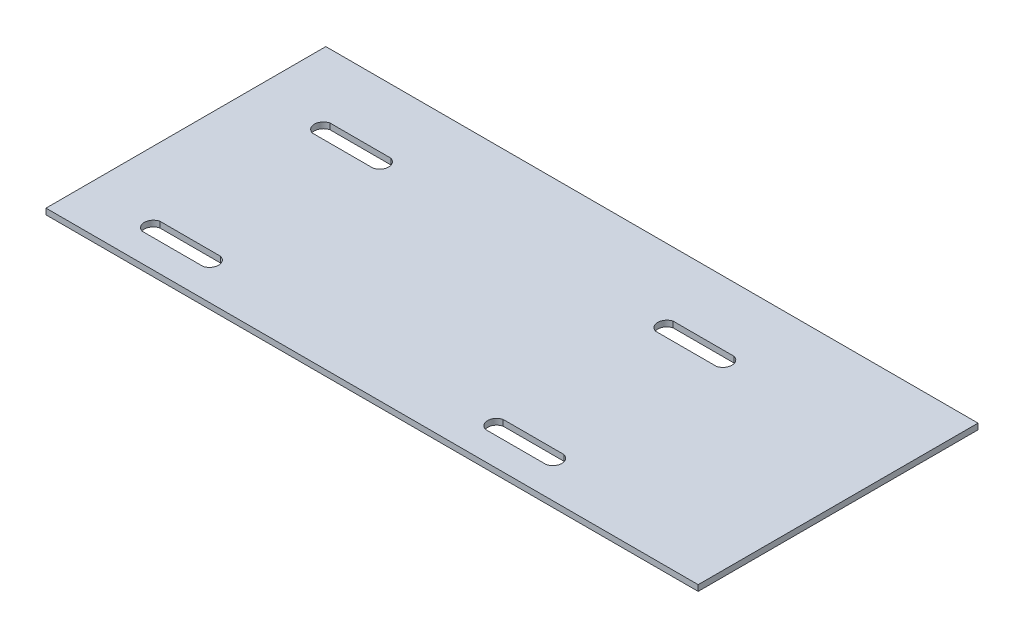
ISO-10303-21;
HEADER;
FILE_DESCRIPTION(('STEP AP214'),'2;1');
FILE_NAME('part.step','',(''),(''),'','','');
FILE_SCHEMA(('AUTOMOTIVE_DESIGN { 1 0 10303 214 1 1 1 1 }'));
ENDSEC;
DATA;
#1=APPLICATION_CONTEXT('core data for automotive mechanical design processes');
#2=APPLICATION_PROTOCOL_DEFINITION('international standard','automotive_design',2000,#1);
#3=PRODUCT_CONTEXT('',#1,'mechanical');
#4=PRODUCT('Part','Part','',(#3));
#5=PRODUCT_RELATED_PRODUCT_CATEGORY('part','',(#4));
#6=PRODUCT_DEFINITION_FORMATION('','',#4);
#7=PRODUCT_DEFINITION_CONTEXT('part definition',#1,'design');
#8=PRODUCT_DEFINITION('design','',#6,#7);
#9=PRODUCT_DEFINITION_SHAPE('','',#8);
#10=(LENGTH_UNIT() NAMED_UNIT(*) SI_UNIT(.MILLI.,.METRE.));
#11=(NAMED_UNIT(*) PLANE_ANGLE_UNIT() SI_UNIT($,.RADIAN.));
#12=(NAMED_UNIT(*) SI_UNIT($,.STERADIAN.) SOLID_ANGLE_UNIT());
#13=UNCERTAINTY_MEASURE_WITH_UNIT(LENGTH_MEASURE(1.E-05),#10,'distance_accuracy_value','');
#14=(GEOMETRIC_REPRESENTATION_CONTEXT(3) GLOBAL_UNCERTAINTY_ASSIGNED_CONTEXT((#13)) GLOBAL_UNIT_ASSIGNED_CONTEXT((#10,
#11,#12)) REPRESENTATION_CONTEXT('',''));
#15=CARTESIAN_POINT('',(0.,0.,0.));
#16=DIRECTION('',(0.,0.,1.));
#17=DIRECTION('',(1.,0.,0.));
#18=AXIS2_PLACEMENT_3D('',#15,#16,#17);
#19=CARTESIAN_POINT('',(0.,2.73,0.));
#20=DIRECTION('',(0.,1.,0.));
#21=DIRECTION('',(0.,0.,1.));
#22=AXIS2_PLACEMENT_3D('',#19,#20,#21);
#23=PLANE('',#22);
#24=DIRECTION('',(1.,0.,0.));
#25=VECTOR('',#24,1.);
#26=CARTESIAN_POINT('',(191.162705571737,2.73,-47.0872012496927));
#27=LINE('',#26,#25);
#28=CARTESIAN_POINT('',(191.162705571737,2.73,-47.0872012496927));
#29=VERTEX_POINT('',#28);
#30=CARTESIAN_POINT('',(219.456939220192,2.73,-47.0872012496927));
#31=VERTEX_POINT('',#30);
#32=EDGE_CURVE('E207',#29,#31,#27,.T.);
#33=ORIENTED_EDGE('',*,*,#32,.F.);
#34=CARTESIAN_POINT('',(192.280296995363,2.73,-51.1622012496927));
#35=DIRECTION('',(0.,1.,0.));
#36=DIRECTION('',(0.,0.,1.));
#37=AXIS2_PLACEMENT_3D('',#34,#35,#36);
#38=CIRCLE('',#37,4.2254745993986);
#39=CARTESIAN_POINT('',(191.162705571737,2.73,-55.2372012496927));
#40=VERTEX_POINT('',#39);
#41=EDGE_CURVE('E205',#40,#29,#38,.T.);
#42=ORIENTED_EDGE('',*,*,#41,.F.);
#43=DIRECTION('',(-1.,0.,0.));
#44=VECTOR('',#43,1.);
#45=CARTESIAN_POINT('',(191.162705571737,2.73,-55.2372012496927));
#46=LINE('',#45,#44);
#47=CARTESIAN_POINT('',(219.456939220192,2.73,-55.2372012496927));
#48=VERTEX_POINT('',#47);
#49=EDGE_CURVE('E213',#48,#40,#46,.T.);
#50=ORIENTED_EDGE('',*,*,#49,.F.);
#51=CARTESIAN_POINT('',(218.339347796566,2.73,-51.1622012496927));
#52=DIRECTION('',(0.,1.,0.));
#53=DIRECTION('',(0.,0.,-1.));
#54=AXIS2_PLACEMENT_3D('',#51,#52,#53);
#55=CIRCLE('',#54,4.2254745993986);
#56=EDGE_CURVE('E210',#31,#48,#55,.T.);
#57=ORIENTED_EDGE('',*,*,#56,.F.);
#58=EDGE_LOOP('',(#33,#42,#50,#57));
#59=FACE_BOUND('',#58,.T.);
#60=DIRECTION('',(1.,0.,0.));
#61=VECTOR('',#60,1.);
#62=CARTESIAN_POINT('',(31.6678831757724,2.73,-47.0872012496927));
#63=LINE('',#62,#61);
#64=CARTESIAN_POINT('',(31.6678831757724,2.73,-47.0872012496927));
#65=VERTEX_POINT('',#64);
#66=CARTESIAN_POINT('',(59.9621168242275,2.73,-47.0872012496927));
#67=VERTEX_POINT('',#66);
#68=EDGE_CURVE('E269',#65,#67,#63,.T.);
#69=ORIENTED_EDGE('',*,*,#68,.F.);
#70=CARTESIAN_POINT('',(32.7854745993986,2.73,-51.1622012496927));
#71=DIRECTION('',(0.,1.,0.));
#72=DIRECTION('',(0.,0.,1.));
#73=AXIS2_PLACEMENT_3D('',#70,#71,#72);
#74=CIRCLE('',#73,4.2254745993986);
#75=CARTESIAN_POINT('',(31.6678831757724,2.73,-55.2372012496927));
#76=VERTEX_POINT('',#75);
#77=EDGE_CURVE('E267',#76,#65,#74,.T.);
#78=ORIENTED_EDGE('',*,*,#77,.F.);
#79=DIRECTION('',(-1.,0.,0.));
#80=VECTOR('',#79,1.);
#81=CARTESIAN_POINT('',(31.6678831757724,2.73,-55.2372012496927));
#82=LINE('',#81,#80);
#83=CARTESIAN_POINT('',(59.9621168242275,2.73,-55.2372012496927));
#84=VERTEX_POINT('',#83);
#85=EDGE_CURVE('E275',#84,#76,#82,.T.);
#86=ORIENTED_EDGE('',*,*,#85,.F.);
#87=CARTESIAN_POINT('',(58.8445254006014,2.73,-51.1622012496927));
#88=DIRECTION('',(0.,1.,0.));
#89=DIRECTION('',(0.,0.,-1.));
#90=AXIS2_PLACEMENT_3D('',#87,#88,#89);
#91=CIRCLE('',#90,4.2254745993986);
#92=EDGE_CURVE('E272',#67,#84,#91,.T.);
#93=ORIENTED_EDGE('',*,*,#92,.F.);
#94=EDGE_LOOP('',(#69,#78,#86,#93));
#95=FACE_BOUND('',#94,.T.);
#96=DIRECTION('',(0.,0.,1.));
#97=VECTOR('',#96,1.);
#98=CARTESIAN_POINT('',(0.,2.73,-85.0185893853712));
#99=LINE('',#98,#97);
#100=CARTESIAN_POINT('',(0.,2.73,-85.0185893853712));
#101=VERTEX_POINT('',#100);
#102=CARTESIAN_POINT('',(0.,2.73,44.9814106146288));
#103=VERTEX_POINT('',#102);
#104=EDGE_CURVE('E298',#101,#103,#99,.T.);
#105=ORIENTED_EDGE('',*,*,#104,.T.);
#106=DIRECTION('',(1.,0.,0.));
#107=VECTOR('',#106,1.);
#108=CARTESIAN_POINT('',(0.,2.73,44.9814106146288));
#109=LINE('',#108,#107);
#110=CARTESIAN_POINT('',(303.,2.73,44.9814106146288));
#111=VERTEX_POINT('',#110);
#112=EDGE_CURVE('E301',#103,#111,#109,.T.);
#113=ORIENTED_EDGE('',*,*,#112,.T.);
#114=DIRECTION('',(0.,0.,-1.));
#115=VECTOR('',#114,1.);
#116=CARTESIAN_POINT('',(303.,2.73,-85.0185893853712));
#117=LINE('',#116,#115);
#118=CARTESIAN_POINT('',(303.,2.73,-85.0185893853712));
#119=VERTEX_POINT('',#118);
#120=EDGE_CURVE('E304',#111,#119,#117,.T.);
#121=ORIENTED_EDGE('',*,*,#120,.T.);
#122=DIRECTION('',(-1.,0.,0.));
#123=VECTOR('',#122,1.);
#124=CARTESIAN_POINT('',(0.,2.73,-85.0185893853712));
#125=LINE('',#124,#123);
#126=EDGE_CURVE('E306',#119,#101,#125,.T.);
#127=ORIENTED_EDGE('',*,*,#126,.T.);
#128=EDGE_LOOP('',(#105,#113,#121,#127));
#129=FACE_BOUND('',#128,.T.);
#130=DIRECTION('',(1.,0.,0.));
#131=VECTOR('',#130,1.);
#132=CARTESIAN_POINT('',(31.6678831757724,2.73,31.9514106146288));
#133=LINE('',#132,#131);
#134=CARTESIAN_POINT('',(31.6678831757724,2.73,31.9514106146288));
#135=VERTEX_POINT('',#134);
#136=CARTESIAN_POINT('',(59.9621168242275,2.73,31.9514106146288));
#137=VERTEX_POINT('',#136);
#138=EDGE_CURVE('E238',#135,#137,#133,.T.);
#139=ORIENTED_EDGE('',*,*,#138,.F.);
#140=CARTESIAN_POINT('',(32.7854745993986,2.73,27.8764106146288));
#141=DIRECTION('',(0.,1.,0.));
#142=DIRECTION('',(0.,0.,1.));
#143=AXIS2_PLACEMENT_3D('',#140,#141,#142);
#144=CIRCLE('',#143,4.2254745993986);
#145=CARTESIAN_POINT('',(31.6678831757724,2.73,23.8014106146288));
#146=VERTEX_POINT('',#145);
#147=EDGE_CURVE('E236',#146,#135,#144,.T.);
#148=ORIENTED_EDGE('',*,*,#147,.F.);
#149=DIRECTION('',(-1.,0.,0.));
#150=VECTOR('',#149,1.);
#151=CARTESIAN_POINT('',(31.6678831757724,2.73,23.8014106146288));
#152=LINE('',#151,#150);
#153=CARTESIAN_POINT('',(59.9621168242275,2.73,23.8014106146288));
#154=VERTEX_POINT('',#153);
#155=EDGE_CURVE('E244',#154,#146,#152,.T.);
#156=ORIENTED_EDGE('',*,*,#155,.F.);
#157=CARTESIAN_POINT('',(58.8445254006014,2.73,27.8764106146288));
#158=DIRECTION('',(0.,1.,0.));
#159=DIRECTION('',(0.,0.,-1.));
#160=AXIS2_PLACEMENT_3D('',#157,#158,#159);
#161=CIRCLE('',#160,4.2254745993986);
#162=EDGE_CURVE('E241',#137,#154,#161,.T.);
#163=ORIENTED_EDGE('',*,*,#162,.F.);
#164=EDGE_LOOP('',(#139,#148,#156,#163));
#165=FACE_BOUND('',#164,.T.);
#166=DIRECTION('',(1.,0.,0.));
#167=VECTOR('',#166,1.);
#168=CARTESIAN_POINT('',(191.162705571737,2.73,31.9514106146288));
#169=LINE('',#168,#167);
#170=CARTESIAN_POINT('',(191.162705571737,2.73,31.9514106146288));
#171=VERTEX_POINT('',#170);
#172=CARTESIAN_POINT('',(219.456939220192,2.73,31.9514106146288));
#173=VERTEX_POINT('',#172);
#174=EDGE_CURVE('E177',#171,#173,#169,.T.);
#175=ORIENTED_EDGE('',*,*,#174,.F.);
#176=CARTESIAN_POINT('',(192.280296995363,2.73,27.8764106146288));
#177=DIRECTION('',(0.,1.,0.));
#178=DIRECTION('',(0.,0.,1.));
#179=AXIS2_PLACEMENT_3D('',#176,#177,#178);
#180=CIRCLE('',#179,4.2254745993986);
#181=CARTESIAN_POINT('',(191.162705571737,2.73,23.8014106146288));
#182=VERTEX_POINT('',#181);
#183=EDGE_CURVE('E169',#182,#171,#180,.T.);
#184=ORIENTED_EDGE('',*,*,#183,.F.);
#185=DIRECTION('',(-1.,0.,0.));
#186=VECTOR('',#185,1.);
#187=CARTESIAN_POINT('',(191.162705571737,2.73,23.8014106146288));
#188=LINE('',#187,#186);
#189=CARTESIAN_POINT('',(219.456939220192,2.73,23.8014106146288));
#190=VERTEX_POINT('',#189);
#191=EDGE_CURVE('E191',#190,#182,#188,.T.);
#192=ORIENTED_EDGE('',*,*,#191,.F.);
#193=CARTESIAN_POINT('',(218.339347796566,2.73,27.8764106146288));
#194=DIRECTION('',(0.,1.,0.));
#195=DIRECTION('',(0.,0.,-1.));
#196=AXIS2_PLACEMENT_3D('',#193,#194,#195);
#197=CIRCLE('',#196,4.2254745993986);
#198=EDGE_CURVE('E189',#173,#190,#197,.T.);
#199=ORIENTED_EDGE('',*,*,#198,.F.);
#200=EDGE_LOOP('',(#175,#184,#192,#199));
#201=FACE_BOUND('',#200,.T.);
#202=ADVANCED_FACE('F32',(#59,#95,#129,#165,#201),#23,.T.);
#203=CARTESIAN_POINT('',(0.,0.,0.));
#204=DIRECTION('',(0.,1.,0.));
#205=DIRECTION('',(0.,0.,1.));
#206=AXIS2_PLACEMENT_3D('',#203,#204,#205);
#207=PLANE('',#206);
#208=CARTESIAN_POINT('',(192.280296995363,0.,-51.1622012496927));
#209=DIRECTION('',(0.,1.,0.));
#210=DIRECTION('',(0.,0.,1.));
#211=AXIS2_PLACEMENT_3D('',#208,#209,#210);
#212=CIRCLE('',#211,4.2254745993986);
#213=CARTESIAN_POINT('',(191.162705571737,0.,-55.2372012496927));
#214=VERTEX_POINT('',#213);
#215=CARTESIAN_POINT('',(191.162705571737,0.,-47.0872012496927));
#216=VERTEX_POINT('',#215);
#217=EDGE_CURVE('E185',#214,#216,#212,.T.);
#218=ORIENTED_EDGE('',*,*,#217,.T.);
#219=DIRECTION('',(1.,0.,0.));
#220=VECTOR('',#219,1.);
#221=CARTESIAN_POINT('',(191.162705571737,0.,-47.0872012496927));
#222=LINE('',#221,#220);
#223=CARTESIAN_POINT('',(219.456939220192,0.,-47.0872012496927));
#224=VERTEX_POINT('',#223);
#225=EDGE_CURVE('E218',#216,#224,#222,.T.);
#226=ORIENTED_EDGE('',*,*,#225,.T.);
#227=CARTESIAN_POINT('',(218.339347796566,0.,-51.1622012496927));
#228=DIRECTION('',(0.,1.,0.));
#229=DIRECTION('',(0.,0.,-1.));
#230=AXIS2_PLACEMENT_3D('',#227,#228,#229);
#231=CIRCLE('',#230,4.2254745993986);
#232=CARTESIAN_POINT('',(219.456939220192,0.,-55.2372012496927));
#233=VERTEX_POINT('',#232);
#234=EDGE_CURVE('E221',#224,#233,#231,.T.);
#235=ORIENTED_EDGE('',*,*,#234,.T.);
#236=DIRECTION('',(-1.,0.,0.));
#237=VECTOR('',#236,1.);
#238=CARTESIAN_POINT('',(191.162705571737,0.,-55.2372012496927));
#239=LINE('',#238,#237);
#240=EDGE_CURVE('E208',#233,#214,#239,.T.);
#241=ORIENTED_EDGE('',*,*,#240,.T.);
#242=EDGE_LOOP('',(#218,#226,#235,#241));
#243=FACE_BOUND('',#242,.T.);
#244=CARTESIAN_POINT('',(32.7854745993986,0.,-51.1622012496927));
#245=DIRECTION('',(0.,1.,0.));
#246=DIRECTION('',(0.,0.,1.));
#247=AXIS2_PLACEMENT_3D('',#244,#245,#246);
#248=CIRCLE('',#247,4.2254745993986);
#249=CARTESIAN_POINT('',(31.6678831757724,0.,-55.2372012496927));
#250=VERTEX_POINT('',#249);
#251=CARTESIAN_POINT('',(31.6678831757724,0.,-47.0872012496927));
#252=VERTEX_POINT('',#251);
#253=EDGE_CURVE('E266',#250,#252,#248,.T.);
#254=ORIENTED_EDGE('',*,*,#253,.T.);
#255=DIRECTION('',(1.,0.,0.));
#256=VECTOR('',#255,1.);
#257=CARTESIAN_POINT('',(31.6678831757724,0.,-47.0872012496927));
#258=LINE('',#257,#256);
#259=CARTESIAN_POINT('',(59.9621168242275,0.,-47.0872012496927));
#260=VERTEX_POINT('',#259);
#261=EDGE_CURVE('E280',#252,#260,#258,.T.);
#262=ORIENTED_EDGE('',*,*,#261,.T.);
#263=CARTESIAN_POINT('',(58.8445254006014,0.,-51.1622012496927));
#264=DIRECTION('',(0.,1.,0.));
#265=DIRECTION('',(0.,0.,-1.));
#266=AXIS2_PLACEMENT_3D('',#263,#264,#265);
#267=CIRCLE('',#266,4.2254745993986);
#268=CARTESIAN_POINT('',(59.9621168242275,0.,-55.2372012496927));
#269=VERTEX_POINT('',#268);
#270=EDGE_CURVE('E283',#260,#269,#267,.T.);
#271=ORIENTED_EDGE('',*,*,#270,.T.);
#272=DIRECTION('',(-1.,0.,0.));
#273=VECTOR('',#272,1.);
#274=CARTESIAN_POINT('',(31.6678831757724,0.,-55.2372012496927));
#275=LINE('',#274,#273);
#276=EDGE_CURVE('E270',#269,#250,#275,.T.);
#277=ORIENTED_EDGE('',*,*,#276,.T.);
#278=EDGE_LOOP('',(#254,#262,#271,#277));
#279=FACE_BOUND('',#278,.T.);
#280=DIRECTION('',(0.,0.,1.));
#281=VECTOR('',#280,1.);
#282=CARTESIAN_POINT('',(0.,0.,-85.0185893853712));
#283=LINE('',#282,#281);
#284=CARTESIAN_POINT('',(0.,0.,-85.0185893853712));
#285=VERTEX_POINT('',#284);
#286=CARTESIAN_POINT('',(0.,0.,44.9814106146288));
#287=VERTEX_POINT('',#286);
#288=EDGE_CURVE('E297',#285,#287,#283,.T.);
#289=ORIENTED_EDGE('',*,*,#288,.F.);
#290=DIRECTION('',(-1.,0.,0.));
#291=VECTOR('',#290,1.);
#292=CARTESIAN_POINT('',(0.,0.,-85.0185893853712));
#293=LINE('',#292,#291);
#294=CARTESIAN_POINT('',(303.,0.,-85.0185893853712));
#295=VERTEX_POINT('',#294);
#296=EDGE_CURVE('E302',#295,#285,#293,.T.);
#297=ORIENTED_EDGE('',*,*,#296,.F.);
#298=DIRECTION('',(0.,0.,-1.));
#299=VECTOR('',#298,1.);
#300=CARTESIAN_POINT('',(303.,0.,-85.0185893853712));
#301=LINE('',#300,#299);
#302=CARTESIAN_POINT('',(303.,0.,44.9814106146288));
#303=VERTEX_POINT('',#302);
#304=EDGE_CURVE('E313',#303,#295,#301,.T.);
#305=ORIENTED_EDGE('',*,*,#304,.F.);
#306=DIRECTION('',(1.,0.,0.));
#307=VECTOR('',#306,1.);
#308=CARTESIAN_POINT('',(0.,0.,44.9814106146288));
#309=LINE('',#308,#307);
#310=EDGE_CURVE('E311',#287,#303,#309,.T.);
#311=ORIENTED_EDGE('',*,*,#310,.F.);
#312=EDGE_LOOP('',(#289,#297,#305,#311));
#313=FACE_BOUND('',#312,.T.);
#314=CARTESIAN_POINT('',(32.7854745993986,0.,27.8764106146288));
#315=DIRECTION('',(0.,1.,0.));
#316=DIRECTION('',(0.,0.,1.));
#317=AXIS2_PLACEMENT_3D('',#314,#315,#316);
#318=CIRCLE('',#317,4.2254745993986);
#319=CARTESIAN_POINT('',(31.6678831757724,0.,23.8014106146288));
#320=VERTEX_POINT('',#319);
#321=CARTESIAN_POINT('',(31.6678831757724,0.,31.9514106146288));
#322=VERTEX_POINT('',#321);
#323=EDGE_CURVE('E235',#320,#322,#318,.T.);
#324=ORIENTED_EDGE('',*,*,#323,.T.);
#325=DIRECTION('',(1.,0.,0.));
#326=VECTOR('',#325,1.);
#327=CARTESIAN_POINT('',(31.6678831757724,0.,31.9514106146288));
#328=LINE('',#327,#326);
#329=CARTESIAN_POINT('',(59.9621168242275,0.,31.9514106146288));
#330=VERTEX_POINT('',#329);
#331=EDGE_CURVE('E249',#322,#330,#328,.T.);
#332=ORIENTED_EDGE('',*,*,#331,.T.);
#333=CARTESIAN_POINT('',(58.8445254006014,0.,27.8764106146288));
#334=DIRECTION('',(0.,1.,0.));
#335=DIRECTION('',(0.,0.,-1.));
#336=AXIS2_PLACEMENT_3D('',#333,#334,#335);
#337=CIRCLE('',#336,4.2254745993986);
#338=CARTESIAN_POINT('',(59.9621168242275,0.,23.8014106146288));
#339=VERTEX_POINT('',#338);
#340=EDGE_CURVE('E252',#330,#339,#337,.T.);
#341=ORIENTED_EDGE('',*,*,#340,.T.);
#342=DIRECTION('',(-1.,0.,0.));
#343=VECTOR('',#342,1.);
#344=CARTESIAN_POINT('',(31.6678831757724,0.,23.8014106146288));
#345=LINE('',#344,#343);
#346=EDGE_CURVE('E239',#339,#320,#345,.T.);
#347=ORIENTED_EDGE('',*,*,#346,.T.);
#348=EDGE_LOOP('',(#324,#332,#341,#347));
#349=FACE_BOUND('',#348,.T.);
#350=CARTESIAN_POINT('',(192.280296995363,0.,27.8764106146288));
#351=DIRECTION('',(0.,1.,0.));
#352=DIRECTION('',(0.,0.,1.));
#353=AXIS2_PLACEMENT_3D('',#350,#351,#352);
#354=CIRCLE('',#353,4.2254745993986);
#355=CARTESIAN_POINT('',(191.162705571737,0.,23.8014106146288));
#356=VERTEX_POINT('',#355);
#357=CARTESIAN_POINT('',(191.162705571737,0.,31.9514106146288));
#358=VERTEX_POINT('',#357);
#359=EDGE_CURVE('E55',#356,#358,#354,.T.);
#360=ORIENTED_EDGE('',*,*,#359,.T.);
#361=DIRECTION('',(1.,0.,0.));
#362=VECTOR('',#361,1.);
#363=CARTESIAN_POINT('',(191.162705571737,0.,31.9514106146288));
#364=LINE('',#363,#362);
#365=CARTESIAN_POINT('',(219.456939220192,0.,31.9514106146288));
#366=VERTEX_POINT('',#365);
#367=EDGE_CURVE('E184',#358,#366,#364,.T.);
#368=ORIENTED_EDGE('',*,*,#367,.T.);
#369=CARTESIAN_POINT('',(218.339347796566,0.,27.8764106146288));
#370=DIRECTION('',(0.,1.,0.));
#371=DIRECTION('',(0.,0.,-1.));
#372=AXIS2_PLACEMENT_3D('',#369,#370,#371);
#373=CIRCLE('',#372,4.2254745993986);
#374=CARTESIAN_POINT('',(219.456939220192,0.,23.8014106146288));
#375=VERTEX_POINT('',#374);
#376=EDGE_CURVE('E197',#366,#375,#373,.T.);
#377=ORIENTED_EDGE('',*,*,#376,.T.);
#378=DIRECTION('',(-1.,0.,0.));
#379=VECTOR('',#378,1.);
#380=CARTESIAN_POINT('',(191.162705571737,0.,23.8014106146288));
#381=LINE('',#380,#379);
#382=EDGE_CURVE('E178',#375,#356,#381,.T.);
#383=ORIENTED_EDGE('',*,*,#382,.T.);
#384=EDGE_LOOP('',(#360,#368,#377,#383));
#385=FACE_BOUND('',#384,.T.);
#386=ADVANCED_FACE('F331',(#243,#279,#313,#349,#385),#207,.F.);
#387=CARTESIAN_POINT('',(0.,2.73,-85.0185893853712));
#388=DIRECTION('',(1.,0.,0.));
#389=DIRECTION('',(0.,0.,-1.));
#390=AXIS2_PLACEMENT_3D('',#387,#388,#389);
#391=PLANE('',#390);
#392=ORIENTED_EDGE('',*,*,#288,.T.);
#393=DIRECTION('',(0.,-1.,0.));
#394=VECTOR('',#393,1.);
#395=CARTESIAN_POINT('',(0.,2.73,44.9814106146288));
#396=LINE('',#395,#394);
#397=EDGE_CURVE('E11',#103,#287,#396,.T.);
#398=ORIENTED_EDGE('',*,*,#397,.F.);
#399=ORIENTED_EDGE('',*,*,#104,.F.);
#400=DIRECTION('',(0.,-1.,0.));
#401=VECTOR('',#400,1.);
#402=CARTESIAN_POINT('',(0.,2.73,-85.0185893853712));
#403=LINE('',#402,#401);
#404=EDGE_CURVE('E308',#101,#285,#403,.T.);
#405=ORIENTED_EDGE('',*,*,#404,.T.);
#406=EDGE_LOOP('',(#392,#398,#399,#405));
#407=FACE_BOUND('',#406,.T.);
#408=ADVANCED_FACE('F34',(#407),#391,.F.);
#409=CARTESIAN_POINT('',(0.,2.73,44.9814106146288));
#410=DIRECTION('',(0.,0.,-1.));
#411=DIRECTION('',(-1.,0.,0.));
#412=AXIS2_PLACEMENT_3D('',#409,#410,#411);
#413=PLANE('',#412);
#414=ORIENTED_EDGE('',*,*,#310,.T.);
#415=DIRECTION('',(0.,-1.,0.));
#416=VECTOR('',#415,1.);
#417=CARTESIAN_POINT('',(303.,2.73,44.9814106146288));
#418=LINE('',#417,#416);
#419=EDGE_CURVE('E40',#111,#303,#418,.T.);
#420=ORIENTED_EDGE('',*,*,#419,.F.);
#421=ORIENTED_EDGE('',*,*,#112,.F.);
#422=ORIENTED_EDGE('',*,*,#397,.T.);
#423=EDGE_LOOP('',(#414,#420,#421,#422));
#424=FACE_BOUND('',#423,.T.);
#425=ADVANCED_FACE('F342',(#424),#413,.F.);
#426=CARTESIAN_POINT('',(303.,2.73,-85.0185893853712));
#427=DIRECTION('',(-1.,0.,0.));
#428=DIRECTION('',(0.,0.,1.));
#429=AXIS2_PLACEMENT_3D('',#426,#427,#428);
#430=PLANE('',#429);
#431=ORIENTED_EDGE('',*,*,#304,.T.);
#432=DIRECTION('',(0.,-1.,0.));
#433=VECTOR('',#432,1.);
#434=CARTESIAN_POINT('',(303.,2.73,-85.0185893853712));
#435=LINE('',#434,#433);
#436=EDGE_CURVE('E318',#119,#295,#435,.T.);
#437=ORIENTED_EDGE('',*,*,#436,.F.);
#438=ORIENTED_EDGE('',*,*,#120,.F.);
#439=ORIENTED_EDGE('',*,*,#419,.T.);
#440=EDGE_LOOP('',(#431,#437,#438,#439));
#441=FACE_BOUND('',#440,.T.);
#442=ADVANCED_FACE('F325',(#441),#430,.F.);
#443=CARTESIAN_POINT('',(0.,2.73,-85.0185893853712));
#444=DIRECTION('',(0.,0.,1.));
#445=DIRECTION('',(1.,0.,0.));
#446=AXIS2_PLACEMENT_3D('',#443,#444,#445);
#447=PLANE('',#446);
#448=ORIENTED_EDGE('',*,*,#296,.T.);
#449=ORIENTED_EDGE('',*,*,#404,.F.);
#450=ORIENTED_EDGE('',*,*,#126,.F.);
#451=ORIENTED_EDGE('',*,*,#436,.T.);
#452=EDGE_LOOP('',(#448,#449,#450,#451));
#453=FACE_BOUND('',#452,.T.);
#454=ADVANCED_FACE('F335',(#453),#447,.F.);
#455=CARTESIAN_POINT('',(32.7854745993986,2.73,-51.1622012496927));
#456=DIRECTION('',(0.,-1.,0.));
#457=DIRECTION('',(0.,0.,-1.));
#458=AXIS2_PLACEMENT_3D('',#455,#456,#457);
#459=CYLINDRICAL_SURFACE('',#458,4.2254745993986);
#460=ORIENTED_EDGE('',*,*,#253,.F.);
#461=DIRECTION('',(0.,-1.,0.));
#462=VECTOR('',#461,1.);
#463=CARTESIAN_POINT('',(31.6678831757724,2.73,-55.2372012496927));
#464=LINE('',#463,#462);
#465=EDGE_CURVE('E277',#76,#250,#464,.T.);
#466=ORIENTED_EDGE('',*,*,#465,.F.);
#467=ORIENTED_EDGE('',*,*,#77,.T.);
#468=DIRECTION('',(0.,-1.,0.));
#469=VECTOR('',#468,1.);
#470=CARTESIAN_POINT('',(31.6678831757724,2.73,-47.0872012496927));
#471=LINE('',#470,#469);
#472=EDGE_CURVE('E294',#65,#252,#471,.T.);
#473=ORIENTED_EDGE('',*,*,#472,.T.);
#474=EDGE_LOOP('',(#460,#466,#467,#473));
#475=FACE_BOUND('',#474,.T.);
#476=ADVANCED_FACE('F360',(#475),#459,.F.);
#477=CARTESIAN_POINT('',(31.6678831757724,2.73,-47.0872012496927));
#478=DIRECTION('',(0.,0.,-1.));
#479=DIRECTION('',(-1.,0.,0.));
#480=AXIS2_PLACEMENT_3D('',#477,#478,#479);
#481=PLANE('',#480);
#482=ORIENTED_EDGE('',*,*,#261,.F.);
#483=ORIENTED_EDGE('',*,*,#472,.F.);
#484=ORIENTED_EDGE('',*,*,#68,.T.);
#485=DIRECTION('',(0.,-1.,0.));
#486=VECTOR('',#485,1.);
#487=CARTESIAN_POINT('',(59.9621168242275,2.73,-47.0872012496927));
#488=LINE('',#487,#486);
#489=EDGE_CURVE('E292',#67,#260,#488,.T.);
#490=ORIENTED_EDGE('',*,*,#489,.T.);
#491=EDGE_LOOP('',(#482,#483,#484,#490));
#492=FACE_BOUND('',#491,.T.);
#493=ADVANCED_FACE('F367',(#492),#481,.T.);
#494=CARTESIAN_POINT('',(58.8445254006014,2.73,-51.1622012496927));
#495=DIRECTION('',(0.,-1.,0.));
#496=DIRECTION('',(0.,0.,-1.));
#497=AXIS2_PLACEMENT_3D('',#494,#495,#496);
#498=CYLINDRICAL_SURFACE('',#497,4.2254745993986);
#499=ORIENTED_EDGE('',*,*,#270,.F.);
#500=ORIENTED_EDGE('',*,*,#489,.F.);
#501=ORIENTED_EDGE('',*,*,#92,.T.);
#502=DIRECTION('',(0.,-1.,0.));
#503=VECTOR('',#502,1.);
#504=CARTESIAN_POINT('',(59.9621168242275,2.73,-55.2372012496927));
#505=LINE('',#504,#503);
#506=EDGE_CURVE('E290',#84,#269,#505,.T.);
#507=ORIENTED_EDGE('',*,*,#506,.T.);
#508=EDGE_LOOP('',(#499,#500,#501,#507));
#509=FACE_BOUND('',#508,.T.);
#510=ADVANCED_FACE('F372',(#509),#498,.F.);
#511=CARTESIAN_POINT('',(31.6678831757724,2.73,-55.2372012496927));
#512=DIRECTION('',(0.,0.,1.));
#513=DIRECTION('',(1.,0.,0.));
#514=AXIS2_PLACEMENT_3D('',#511,#512,#513);
#515=PLANE('',#514);
#516=ORIENTED_EDGE('',*,*,#276,.F.);
#517=ORIENTED_EDGE('',*,*,#506,.F.);
#518=ORIENTED_EDGE('',*,*,#85,.T.);
#519=ORIENTED_EDGE('',*,*,#465,.T.);
#520=EDGE_LOOP('',(#516,#517,#518,#519));
#521=FACE_BOUND('',#520,.T.);
#522=ADVANCED_FACE('F380',(#521),#515,.T.);
#523=CARTESIAN_POINT('',(32.7854745993986,2.73,27.8764106146288));
#524=DIRECTION('',(0.,-1.,0.));
#525=DIRECTION('',(0.,0.,-1.));
#526=AXIS2_PLACEMENT_3D('',#523,#524,#525);
#527=CYLINDRICAL_SURFACE('',#526,4.2254745993986);
#528=ORIENTED_EDGE('',*,*,#323,.F.);
#529=DIRECTION('',(0.,-1.,0.));
#530=VECTOR('',#529,1.);
#531=CARTESIAN_POINT('',(31.6678831757724,2.73,23.8014106146288));
#532=LINE('',#531,#530);
#533=EDGE_CURVE('E246',#146,#320,#532,.T.);
#534=ORIENTED_EDGE('',*,*,#533,.F.);
#535=ORIENTED_EDGE('',*,*,#147,.T.);
#536=DIRECTION('',(0.,-1.,0.));
#537=VECTOR('',#536,1.);
#538=CARTESIAN_POINT('',(31.6678831757724,2.73,31.9514106146288));
#539=LINE('',#538,#537);
#540=EDGE_CURVE('E263',#135,#322,#539,.T.);
#541=ORIENTED_EDGE('',*,*,#540,.T.);
#542=EDGE_LOOP('',(#528,#534,#535,#541));
#543=FACE_BOUND('',#542,.T.);
#544=ADVANCED_FACE('F392',(#543),#527,.F.);
#545=CARTESIAN_POINT('',(31.6678831757724,2.73,31.9514106146288));
#546=DIRECTION('',(0.,0.,-1.));
#547=DIRECTION('',(-1.,0.,0.));
#548=AXIS2_PLACEMENT_3D('',#545,#546,#547);
#549=PLANE('',#548);
#550=ORIENTED_EDGE('',*,*,#331,.F.);
#551=ORIENTED_EDGE('',*,*,#540,.F.);
#552=ORIENTED_EDGE('',*,*,#138,.T.);
#553=DIRECTION('',(0.,-1.,0.));
#554=VECTOR('',#553,1.);
#555=CARTESIAN_POINT('',(59.9621168242275,2.73,31.9514106146288));
#556=LINE('',#555,#554);
#557=EDGE_CURVE('E261',#137,#330,#556,.T.);
#558=ORIENTED_EDGE('',*,*,#557,.T.);
#559=EDGE_LOOP('',(#550,#551,#552,#558));
#560=FACE_BOUND('',#559,.T.);
#561=ADVANCED_FACE('F397',(#560),#549,.T.);
#562=CARTESIAN_POINT('',(58.8445254006014,2.73,27.8764106146288));
#563=DIRECTION('',(0.,-1.,0.));
#564=DIRECTION('',(0.,0.,-1.));
#565=AXIS2_PLACEMENT_3D('',#562,#563,#564);
#566=CYLINDRICAL_SURFACE('',#565,4.2254745993986);
#567=ORIENTED_EDGE('',*,*,#340,.F.);
#568=ORIENTED_EDGE('',*,*,#557,.F.);
#569=ORIENTED_EDGE('',*,*,#162,.T.);
#570=DIRECTION('',(0.,-1.,0.));
#571=VECTOR('',#570,1.);
#572=CARTESIAN_POINT('',(59.9621168242275,2.73,23.8014106146288));
#573=LINE('',#572,#571);
#574=EDGE_CURVE('E259',#154,#339,#573,.T.);
#575=ORIENTED_EDGE('',*,*,#574,.T.);
#576=EDGE_LOOP('',(#567,#568,#569,#575));
#577=FACE_BOUND('',#576,.T.);
#578=ADVANCED_FACE('F401',(#577),#566,.F.);
#579=CARTESIAN_POINT('',(31.6678831757724,2.73,23.8014106146288));
#580=DIRECTION('',(0.,0.,1.));
#581=DIRECTION('',(1.,0.,0.));
#582=AXIS2_PLACEMENT_3D('',#579,#580,#581);
#583=PLANE('',#582);
#584=ORIENTED_EDGE('',*,*,#346,.F.);
#585=ORIENTED_EDGE('',*,*,#574,.F.);
#586=ORIENTED_EDGE('',*,*,#155,.T.);
#587=ORIENTED_EDGE('',*,*,#533,.T.);
#588=EDGE_LOOP('',(#584,#585,#586,#587));
#589=FACE_BOUND('',#588,.T.);
#590=ADVANCED_FACE('F405',(#589),#583,.T.);
#591=CARTESIAN_POINT('',(192.280296995363,2.73,-51.1622012496927));
#592=DIRECTION('',(0.,-1.,0.));
#593=DIRECTION('',(0.,0.,-1.));
#594=AXIS2_PLACEMENT_3D('',#591,#592,#593);
#595=CYLINDRICAL_SURFACE('',#594,4.2254745993986);
#596=ORIENTED_EDGE('',*,*,#217,.F.);
#597=DIRECTION('',(0.,-1.,0.));
#598=VECTOR('',#597,1.);
#599=CARTESIAN_POINT('',(191.162705571737,2.73,-55.2372012496927));
#600=LINE('',#599,#598);
#601=EDGE_CURVE('E215',#40,#214,#600,.T.);
#602=ORIENTED_EDGE('',*,*,#601,.F.);
#603=ORIENTED_EDGE('',*,*,#41,.T.);
#604=DIRECTION('',(0.,-1.,0.));
#605=VECTOR('',#604,1.);
#606=CARTESIAN_POINT('',(191.162705571737,2.73,-47.0872012496927));
#607=LINE('',#606,#605);
#608=EDGE_CURVE('E232',#29,#216,#607,.T.);
#609=ORIENTED_EDGE('',*,*,#608,.T.);
#610=EDGE_LOOP('',(#596,#602,#603,#609));
#611=FACE_BOUND('',#610,.T.);
#612=ADVANCED_FACE('F409',(#611),#595,.F.);
#613=CARTESIAN_POINT('',(191.162705571737,2.73,-47.0872012496927));
#614=DIRECTION('',(0.,0.,-1.));
#615=DIRECTION('',(-1.,0.,0.));
#616=AXIS2_PLACEMENT_3D('',#613,#614,#615);
#617=PLANE('',#616);
#618=ORIENTED_EDGE('',*,*,#225,.F.);
#619=ORIENTED_EDGE('',*,*,#608,.F.);
#620=ORIENTED_EDGE('',*,*,#32,.T.);
#621=DIRECTION('',(0.,-1.,0.));
#622=VECTOR('',#621,1.);
#623=CARTESIAN_POINT('',(219.456939220192,2.73,-47.0872012496927));
#624=LINE('',#623,#622);
#625=EDGE_CURVE('E230',#31,#224,#624,.T.);
#626=ORIENTED_EDGE('',*,*,#625,.T.);
#627=EDGE_LOOP('',(#618,#619,#620,#626));
#628=FACE_BOUND('',#627,.T.);
#629=ADVANCED_FACE('F413',(#628),#617,.T.);
#630=CARTESIAN_POINT('',(218.339347796566,2.73,-51.1622012496927));
#631=DIRECTION('',(0.,-1.,0.));
#632=DIRECTION('',(0.,0.,-1.));
#633=AXIS2_PLACEMENT_3D('',#630,#631,#632);
#634=CYLINDRICAL_SURFACE('',#633,4.2254745993986);
#635=ORIENTED_EDGE('',*,*,#234,.F.);
#636=ORIENTED_EDGE('',*,*,#625,.F.);
#637=ORIENTED_EDGE('',*,*,#56,.T.);
#638=DIRECTION('',(0.,-1.,0.));
#639=VECTOR('',#638,1.);
#640=CARTESIAN_POINT('',(219.456939220192,2.73,-55.2372012496927));
#641=LINE('',#640,#639);
#642=EDGE_CURVE('E228',#48,#233,#641,.T.);
#643=ORIENTED_EDGE('',*,*,#642,.T.);
#644=EDGE_LOOP('',(#635,#636,#637,#643));
#645=FACE_BOUND('',#644,.T.);
#646=ADVANCED_FACE('F417',(#645),#634,.F.);
#647=CARTESIAN_POINT('',(191.162705571737,2.73,-55.2372012496927));
#648=DIRECTION('',(0.,0.,1.));
#649=DIRECTION('',(1.,0.,0.));
#650=AXIS2_PLACEMENT_3D('',#647,#648,#649);
#651=PLANE('',#650);
#652=ORIENTED_EDGE('',*,*,#240,.F.);
#653=ORIENTED_EDGE('',*,*,#642,.F.);
#654=ORIENTED_EDGE('',*,*,#49,.T.);
#655=ORIENTED_EDGE('',*,*,#601,.T.);
#656=EDGE_LOOP('',(#652,#653,#654,#655));
#657=FACE_BOUND('',#656,.T.);
#658=ADVANCED_FACE('F421',(#657),#651,.T.);
#659=CARTESIAN_POINT('',(192.280296995363,2.73,27.8764106146288));
#660=DIRECTION('',(0.,-1.,0.));
#661=DIRECTION('',(0.,0.,-1.));
#662=AXIS2_PLACEMENT_3D('',#659,#660,#661);
#663=CYLINDRICAL_SURFACE('',#662,4.2254745993986);
#664=ORIENTED_EDGE('',*,*,#359,.F.);
#665=DIRECTION('',(0.,-1.,0.));
#666=VECTOR('',#665,1.);
#667=CARTESIAN_POINT('',(191.162705571737,2.73,23.8014106146288));
#668=LINE('',#667,#666);
#669=EDGE_CURVE('E173',#182,#356,#668,.T.);
#670=ORIENTED_EDGE('',*,*,#669,.F.);
#671=ORIENTED_EDGE('',*,*,#183,.T.);
#672=DIRECTION('',(0.,-1.,0.));
#673=VECTOR('',#672,1.);
#674=CARTESIAN_POINT('',(191.162705571737,2.73,31.9514106146288));
#675=LINE('',#674,#673);
#676=EDGE_CURVE('E172',#171,#358,#675,.T.);
#677=ORIENTED_EDGE('',*,*,#676,.T.);
#678=EDGE_LOOP('',(#664,#670,#671,#677));
#679=FACE_BOUND('',#678,.T.);
#680=ADVANCED_FACE('F171',(#679),#663,.F.);
#681=CARTESIAN_POINT('',(191.162705571737,2.73,31.9514106146288));
#682=DIRECTION('',(0.,0.,-1.));
#683=DIRECTION('',(-1.,0.,0.));
#684=AXIS2_PLACEMENT_3D('',#681,#682,#683);
#685=PLANE('',#684);
#686=ORIENTED_EDGE('',*,*,#367,.F.);
#687=ORIENTED_EDGE('',*,*,#676,.F.);
#688=ORIENTED_EDGE('',*,*,#174,.T.);
#689=DIRECTION('',(0.,-1.,0.));
#690=VECTOR('',#689,1.);
#691=CARTESIAN_POINT('',(219.456939220192,2.73,31.9514106146288));
#692=LINE('',#691,#690);
#693=EDGE_CURVE('E186',#173,#366,#692,.T.);
#694=ORIENTED_EDGE('',*,*,#693,.T.);
#695=EDGE_LOOP('',(#686,#687,#688,#694));
#696=FACE_BOUND('',#695,.T.);
#697=ADVANCED_FACE('F181',(#696),#685,.T.);
#698=CARTESIAN_POINT('',(218.339347796566,2.73,27.8764106146288));
#699=DIRECTION('',(0.,-1.,0.));
#700=DIRECTION('',(0.,0.,-1.));
#701=AXIS2_PLACEMENT_3D('',#698,#699,#700);
#702=CYLINDRICAL_SURFACE('',#701,4.2254745993986);
#703=ORIENTED_EDGE('',*,*,#376,.F.);
#704=ORIENTED_EDGE('',*,*,#693,.F.);
#705=ORIENTED_EDGE('',*,*,#198,.T.);
#706=DIRECTION('',(0.,-1.,0.));
#707=VECTOR('',#706,1.);
#708=CARTESIAN_POINT('',(219.456939220192,2.73,23.8014106146288));
#709=LINE('',#708,#707);
#710=EDGE_CURVE('E47',#190,#375,#709,.T.);
#711=ORIENTED_EDGE('',*,*,#710,.T.);
#712=EDGE_LOOP('',(#703,#704,#705,#711));
#713=FACE_BOUND('',#712,.T.);
#714=ADVANCED_FACE('F430',(#713),#702,.F.);
#715=CARTESIAN_POINT('',(191.162705571737,2.73,23.8014106146288));
#716=DIRECTION('',(0.,0.,1.));
#717=DIRECTION('',(1.,0.,0.));
#718=AXIS2_PLACEMENT_3D('',#715,#716,#717);
#719=PLANE('',#718);
#720=ORIENTED_EDGE('',*,*,#382,.F.);
#721=ORIENTED_EDGE('',*,*,#710,.F.);
#722=ORIENTED_EDGE('',*,*,#191,.T.);
#723=ORIENTED_EDGE('',*,*,#669,.T.);
#724=EDGE_LOOP('',(#720,#721,#722,#723));
#725=FACE_BOUND('',#724,.T.);
#726=ADVANCED_FACE('F433',(#725),#719,.T.);
#727=CLOSED_SHELL('',(#202,#386,#408,#425,#442,#454,#476,#493,#510,#522,#544,#561,#578,#590,
#612,#629,#646,#658,#680,#697,#714,#726));
#728=MANIFOLD_SOLID_BREP('B2',#727);
#729=ADVANCED_BREP_SHAPE_REPRESENTATION('',(#18,#728),#14);
#730=SHAPE_DEFINITION_REPRESENTATION(#9,#729);
ENDSEC;
END-ISO-10303-21;
